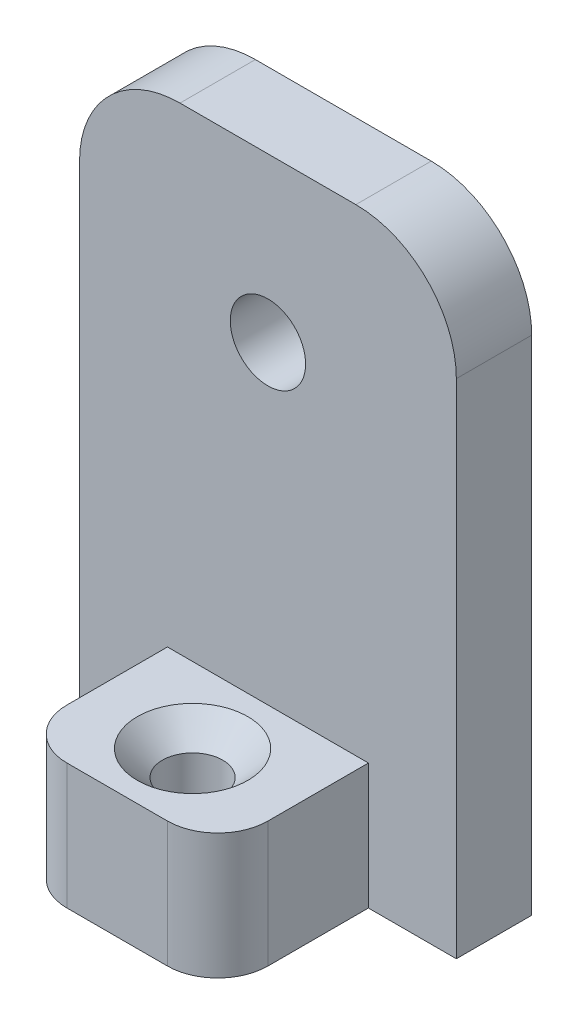
ISO-10303-21;
HEADER;
FILE_DESCRIPTION(('STEP AP214'),'2;1');
FILE_NAME('part.step','',(''),(''),'','','');
FILE_SCHEMA(('AUTOMOTIVE_DESIGN { 1 0 10303 214 1 1 1 1 }'));
ENDSEC;
DATA;
#1=APPLICATION_CONTEXT('core data for automotive mechanical design processes');
#2=APPLICATION_PROTOCOL_DEFINITION('international standard','automotive_design',2000,#1);
#3=PRODUCT_CONTEXT('',#1,'mechanical');
#4=PRODUCT('Part','Part','',(#3));
#5=PRODUCT_RELATED_PRODUCT_CATEGORY('part','',(#4));
#6=PRODUCT_DEFINITION_FORMATION('','',#4);
#7=PRODUCT_DEFINITION_CONTEXT('part definition',#1,'design');
#8=PRODUCT_DEFINITION('design','',#6,#7);
#9=PRODUCT_DEFINITION_SHAPE('','',#8);
#10=(LENGTH_UNIT() NAMED_UNIT(*) SI_UNIT(.MILLI.,.METRE.));
#11=(NAMED_UNIT(*) PLANE_ANGLE_UNIT() SI_UNIT($,.RADIAN.));
#12=(NAMED_UNIT(*) SI_UNIT($,.STERADIAN.) SOLID_ANGLE_UNIT());
#13=UNCERTAINTY_MEASURE_WITH_UNIT(LENGTH_MEASURE(1.E-05),#10,'distance_accuracy_value','');
#14=(GEOMETRIC_REPRESENTATION_CONTEXT(3) GLOBAL_UNCERTAINTY_ASSIGNED_CONTEXT((#13)) GLOBAL_UNIT_ASSIGNED_CONTEXT((#10,
#11,#12)) REPRESENTATION_CONTEXT('',''));
#15=CARTESIAN_POINT('',(0.,0.,0.));
#16=DIRECTION('',(0.,0.,1.));
#17=DIRECTION('',(1.,0.,0.));
#18=AXIS2_PLACEMENT_3D('',#15,#16,#17);
#19=CARTESIAN_POINT('',(0.,0.,3.));
#20=DIRECTION('',(0.,0.,-1.));
#21=DIRECTION('',(-1.,0.,0.));
#22=AXIS2_PLACEMENT_3D('',#19,#20,#21);
#23=PLANE('',#22);
#24=CARTESIAN_POINT('',(0.,5.49999999999999,3.));
#25=DIRECTION('',(0.,0.,-1.));
#26=DIRECTION('',(-1.,0.,0.));
#27=AXIS2_PLACEMENT_3D('',#24,#25,#26);
#28=CIRCLE('',#27,1.5);
#29=CARTESIAN_POINT('',(-1.5,5.49999999999999,3.));
#30=VERTEX_POINT('',#29);
#31=EDGE_CURVE('E259',#30,#30,#28,.F.);
#32=ORIENTED_EDGE('',*,*,#31,.F.);
#33=EDGE_LOOP('',(#32));
#34=FACE_BOUND('',#33,.T.);
#35=DIRECTION('',(-1.,0.,0.));
#36=VECTOR('',#35,1.);
#37=CARTESIAN_POINT('',(-7.5,12.,3.));
#38=LINE('',#37,#36);
#39=CARTESIAN_POINT('',(3.5,12.,3.));
#40=VERTEX_POINT('',#39);
#41=CARTESIAN_POINT('',(-3.5,12.,3.));
#42=VERTEX_POINT('',#41);
#43=EDGE_CURVE('E164',#40,#42,#38,.T.);
#44=ORIENTED_EDGE('',*,*,#43,.T.);
#45=CARTESIAN_POINT('',(-3.5,8.,3.));
#46=DIRECTION('',(0.,0.,-1.));
#47=DIRECTION('',(-1.,0.,0.));
#48=AXIS2_PLACEMENT_3D('',#45,#46,#47);
#49=CIRCLE('',#48,4.);
#50=CARTESIAN_POINT('',(-7.5,8.,3.));
#51=VERTEX_POINT('',#50);
#52=EDGE_CURVE('E43',#42,#51,#49,.F.);
#53=ORIENTED_EDGE('',*,*,#52,.T.);
#54=DIRECTION('',(0.,-1.,0.));
#55=VECTOR('',#54,1.);
#56=CARTESIAN_POINT('',(-7.5,-12.,3.));
#57=LINE('',#56,#55);
#58=CARTESIAN_POINT('',(-7.5,-12.,3.));
#59=VERTEX_POINT('',#58);
#60=EDGE_CURVE('E167',#51,#59,#57,.T.);
#61=ORIENTED_EDGE('',*,*,#60,.T.);
#62=DIRECTION('',(1.,0.,0.));
#63=VECTOR('',#62,1.);
#64=CARTESIAN_POINT('',(-7.5,-12.,3.));
#65=LINE('',#64,#63);
#66=CARTESIAN_POINT('',(-4.,-12.,3.));
#67=VERTEX_POINT('',#66);
#68=EDGE_CURVE('E170',#59,#67,#65,.T.);
#69=ORIENTED_EDGE('',*,*,#68,.T.);
#70=DIRECTION('',(0.,-1.,0.));
#71=VECTOR('',#70,1.);
#72=CARTESIAN_POINT('',(-4.,-12.,3.));
#73=LINE('',#72,#71);
#74=CARTESIAN_POINT('',(-4.,-7.,3.));
#75=VERTEX_POINT('',#74);
#76=EDGE_CURVE('E146',#75,#67,#73,.T.);
#77=ORIENTED_EDGE('',*,*,#76,.F.);
#78=DIRECTION('',(-1.,0.,0.));
#79=VECTOR('',#78,1.);
#80=CARTESIAN_POINT('',(-4.,-7.,3.));
#81=LINE('',#80,#79);
#82=CARTESIAN_POINT('',(4.,-7.,3.));
#83=VERTEX_POINT('',#82);
#84=EDGE_CURVE('E131',#83,#75,#81,.T.);
#85=ORIENTED_EDGE('',*,*,#84,.F.);
#86=DIRECTION('',(0.,1.,0.));
#87=VECTOR('',#86,1.);
#88=CARTESIAN_POINT('',(4.,-12.,3.));
#89=LINE('',#88,#87);
#90=CARTESIAN_POINT('',(4.,-12.,3.));
#91=VERTEX_POINT('',#90);
#92=EDGE_CURVE('E142',#91,#83,#89,.T.);
#93=ORIENTED_EDGE('',*,*,#92,.F.);
#94=CARTESIAN_POINT('',(7.5,-12.,3.));
#95=VERTEX_POINT('',#94);
#96=EDGE_CURVE('E169',#91,#95,#65,.T.);
#97=ORIENTED_EDGE('',*,*,#96,.T.);
#98=DIRECTION('',(0.,1.,0.));
#99=VECTOR('',#98,1.);
#100=CARTESIAN_POINT('',(7.5,-12.,3.));
#101=LINE('',#100,#99);
#102=CARTESIAN_POINT('',(7.5,8.,3.));
#103=VERTEX_POINT('',#102);
#104=EDGE_CURVE('E162',#95,#103,#101,.T.);
#105=ORIENTED_EDGE('',*,*,#104,.T.);
#106=CARTESIAN_POINT('',(3.5,8.,3.));
#107=DIRECTION('',(0.,0.,-1.));
#108=DIRECTION('',(-1.,0.,0.));
#109=AXIS2_PLACEMENT_3D('',#106,#107,#108);
#110=CIRCLE('',#109,4.);
#111=EDGE_CURVE('E212',#103,#40,#110,.F.);
#112=ORIENTED_EDGE('',*,*,#111,.T.);
#113=EDGE_LOOP('',(#44,#53,#61,#69,#77,#85,#93,#97,#105,#112));
#114=FACE_BOUND('',#113,.T.);
#115=ADVANCED_FACE('F35',(#34,#114),#23,.F.);
#116=CARTESIAN_POINT('',(7.5,-12.,3.));
#117=DIRECTION('',(-1.,0.,0.));
#118=DIRECTION('',(0.,0.,1.));
#119=AXIS2_PLACEMENT_3D('',#116,#117,#118);
#120=PLANE('',#119);
#121=DIRECTION('',(0.,1.,0.));
#122=VECTOR('',#121,1.);
#123=CARTESIAN_POINT('',(7.5,-12.,0.));
#124=LINE('',#123,#122);
#125=CARTESIAN_POINT('',(7.5,-12.,0.));
#126=VERTEX_POINT('',#125);
#127=CARTESIAN_POINT('',(7.5,8.,0.));
#128=VERTEX_POINT('',#127);
#129=EDGE_CURVE('E161',#126,#128,#124,.T.);
#130=ORIENTED_EDGE('',*,*,#129,.T.);
#131=DIRECTION('',(0.,0.,-1.));
#132=VECTOR('',#131,1.);
#133=CARTESIAN_POINT('',(7.5,8.,3.));
#134=LINE('',#133,#132);
#135=EDGE_CURVE('E11',#128,#103,#134,.F.);
#136=ORIENTED_EDGE('',*,*,#135,.T.);
#137=ORIENTED_EDGE('',*,*,#104,.F.);
#138=DIRECTION('',(0.,0.,-1.));
#139=VECTOR('',#138,1.);
#140=CARTESIAN_POINT('',(7.5,-12.,3.));
#141=LINE('',#140,#139);
#142=EDGE_CURVE('E172',#95,#126,#141,.T.);
#143=ORIENTED_EDGE('',*,*,#142,.T.);
#144=EDGE_LOOP('',(#130,#136,#137,#143));
#145=FACE_BOUND('',#144,.T.);
#146=ADVANCED_FACE('F232',(#145),#120,.F.);
#147=CARTESIAN_POINT('',(-7.5,12.,3.));
#148=DIRECTION('',(0.,-1.,0.));
#149=DIRECTION('',(0.,0.,-1.));
#150=AXIS2_PLACEMENT_3D('',#147,#148,#149);
#151=PLANE('',#150);
#152=DIRECTION('',(-1.,0.,0.));
#153=VECTOR('',#152,1.);
#154=CARTESIAN_POINT('',(-7.5,12.,0.));
#155=LINE('',#154,#153);
#156=CARTESIAN_POINT('',(3.5,12.,0.));
#157=VERTEX_POINT('',#156);
#158=CARTESIAN_POINT('',(-3.5,12.,0.));
#159=VERTEX_POINT('',#158);
#160=EDGE_CURVE('E174',#157,#159,#155,.T.);
#161=ORIENTED_EDGE('',*,*,#160,.T.);
#162=DIRECTION('',(0.,0.,-1.));
#163=VECTOR('',#162,1.);
#164=CARTESIAN_POINT('',(-3.5,12.,3.));
#165=LINE('',#164,#163);
#166=EDGE_CURVE('E56',#159,#42,#165,.F.);
#167=ORIENTED_EDGE('',*,*,#166,.T.);
#168=ORIENTED_EDGE('',*,*,#43,.F.);
#169=DIRECTION('',(0.,0.,-1.));
#170=VECTOR('',#169,1.);
#171=CARTESIAN_POINT('',(3.5,12.,3.));
#172=LINE('',#171,#170);
#173=EDGE_CURVE('E208',#40,#157,#172,.T.);
#174=ORIENTED_EDGE('',*,*,#173,.T.);
#175=EDGE_LOOP('',(#161,#167,#168,#174));
#176=FACE_BOUND('',#175,.T.);
#177=ADVANCED_FACE('F227',(#176),#151,.F.);
#178=CARTESIAN_POINT('',(-7.5,-12.,3.));
#179=DIRECTION('',(1.,0.,0.));
#180=DIRECTION('',(0.,0.,-1.));
#181=AXIS2_PLACEMENT_3D('',#178,#179,#180);
#182=PLANE('',#181);
#183=ORIENTED_EDGE('',*,*,#60,.F.);
#184=DIRECTION('',(0.,0.,-1.));
#185=VECTOR('',#184,1.);
#186=CARTESIAN_POINT('',(-7.5,8.,3.));
#187=LINE('',#186,#185);
#188=CARTESIAN_POINT('',(-7.5,8.,0.));
#189=VERTEX_POINT('',#188);
#190=EDGE_CURVE('E201',#51,#189,#187,.T.);
#191=ORIENTED_EDGE('',*,*,#190,.T.);
#192=DIRECTION('',(0.,-1.,0.));
#193=VECTOR('',#192,1.);
#194=CARTESIAN_POINT('',(-7.5,-12.,0.));
#195=LINE('',#194,#193);
#196=CARTESIAN_POINT('',(-7.5,-12.,0.));
#197=VERTEX_POINT('',#196);
#198=EDGE_CURVE('E176',#189,#197,#195,.T.);
#199=ORIENTED_EDGE('',*,*,#198,.T.);
#200=DIRECTION('',(0.,0.,-1.));
#201=VECTOR('',#200,1.);
#202=CARTESIAN_POINT('',(-7.5,-12.,3.));
#203=LINE('',#202,#201);
#204=EDGE_CURVE('E181',#59,#197,#203,.T.);
#205=ORIENTED_EDGE('',*,*,#204,.F.);
#206=EDGE_LOOP('',(#183,#191,#199,#205));
#207=FACE_BOUND('',#206,.T.);
#208=ADVANCED_FACE('F219',(#207),#182,.F.);
#209=CARTESIAN_POINT('',(-7.5,-12.,3.));
#210=DIRECTION('',(0.,1.,0.));
#211=DIRECTION('',(0.,0.,1.));
#212=AXIS2_PLACEMENT_3D('',#209,#210,#211);
#213=PLANE('',#212);
#214=CARTESIAN_POINT('',(0.,-12.,6.));
#215=DIRECTION('',(0.,1.,0.));
#216=DIRECTION('',(0.,0.,1.));
#217=AXIS2_PLACEMENT_3D('',#214,#215,#216);
#218=CIRCLE('',#217,1.2);
#219=CARTESIAN_POINT('',(0.,-12.,7.2));
#220=VERTEX_POINT('',#219);
#221=EDGE_CURVE('E152',#220,#220,#218,.F.);
#222=ORIENTED_EDGE('',*,*,#221,.F.);
#223=EDGE_LOOP('',(#222));
#224=FACE_BOUND('',#223,.T.);
#225=DIRECTION('',(0.,0.,-1.));
#226=VECTOR('',#225,1.);
#227=CARTESIAN_POINT('',(4.,-12.,9.));
#228=LINE('',#227,#226);
#229=CARTESIAN_POINT('',(4.,-12.,7.));
#230=VERTEX_POINT('',#229);
#231=EDGE_CURVE('E136',#230,#91,#228,.T.);
#232=ORIENTED_EDGE('',*,*,#231,.F.);
#233=CARTESIAN_POINT('',(2.,-12.,7.));
#234=DIRECTION('',(0.,1.,0.));
#235=DIRECTION('',(0.,0.,1.));
#236=AXIS2_PLACEMENT_3D('',#233,#234,#235);
#237=CIRCLE('',#236,2.);
#238=CARTESIAN_POINT('',(2.,-12.,9.));
#239=VERTEX_POINT('',#238);
#240=EDGE_CURVE('E197',#230,#239,#237,.F.);
#241=ORIENTED_EDGE('',*,*,#240,.T.);
#242=DIRECTION('',(1.,0.,0.));
#243=VECTOR('',#242,1.);
#244=CARTESIAN_POINT('',(-4.,-12.,9.));
#245=LINE('',#244,#243);
#246=CARTESIAN_POINT('',(-2.,-12.,9.));
#247=VERTEX_POINT('',#246);
#248=EDGE_CURVE('E147',#247,#239,#245,.T.);
#249=ORIENTED_EDGE('',*,*,#248,.F.);
#250=CARTESIAN_POINT('',(-2.,-12.,7.));
#251=DIRECTION('',(0.,1.,0.));
#252=DIRECTION('',(0.,0.,1.));
#253=AXIS2_PLACEMENT_3D('',#250,#251,#252);
#254=CIRCLE('',#253,2.);
#255=CARTESIAN_POINT('',(-4.,-12.,7.));
#256=VERTEX_POINT('',#255);
#257=EDGE_CURVE('E195',#247,#256,#254,.F.);
#258=ORIENTED_EDGE('',*,*,#257,.T.);
#259=DIRECTION('',(0.,0.,-1.));
#260=VECTOR('',#259,1.);
#261=CARTESIAN_POINT('',(-4.,-12.,9.));
#262=LINE('',#261,#260);
#263=EDGE_CURVE('E159',#256,#67,#262,.T.);
#264=ORIENTED_EDGE('',*,*,#263,.T.);
#265=ORIENTED_EDGE('',*,*,#68,.F.);
#266=ORIENTED_EDGE('',*,*,#204,.T.);
#267=DIRECTION('',(1.,0.,0.));
#268=VECTOR('',#267,1.);
#269=CARTESIAN_POINT('',(-7.5,-12.,0.));
#270=LINE('',#269,#268);
#271=EDGE_CURVE('E165',#197,#126,#270,.T.);
#272=ORIENTED_EDGE('',*,*,#271,.T.);
#273=ORIENTED_EDGE('',*,*,#142,.F.);
#274=ORIENTED_EDGE('',*,*,#96,.F.);
#275=EDGE_LOOP('',(#232,#241,#249,#258,#264,#265,#266,#272,#273,#274));
#276=FACE_BOUND('',#275,.T.);
#277=ADVANCED_FACE('F235',(#224,#276),#213,.F.);
#278=CARTESIAN_POINT('',(0.,0.,0.));
#279=DIRECTION('',(0.,0.,-1.));
#280=DIRECTION('',(-1.,0.,0.));
#281=AXIS2_PLACEMENT_3D('',#278,#279,#280);
#282=PLANE('',#281);
#283=CARTESIAN_POINT('',(0.,5.49999999999999,0.));
#284=DIRECTION('',(0.,0.,-1.));
#285=DIRECTION('',(-1.,0.,0.));
#286=AXIS2_PLACEMENT_3D('',#283,#284,#285);
#287=CIRCLE('',#286,1.5);
#288=CARTESIAN_POINT('',(-1.5,5.49999999999999,0.));
#289=VERTEX_POINT('',#288);
#290=EDGE_CURVE('E264',#289,#289,#287,.T.);
#291=ORIENTED_EDGE('',*,*,#290,.F.);
#292=EDGE_LOOP('',(#291));
#293=FACE_BOUND('',#292,.T.);
#294=ORIENTED_EDGE('',*,*,#198,.F.);
#295=CARTESIAN_POINT('',(-3.5,8.,0.));
#296=DIRECTION('',(0.,0.,-1.));
#297=DIRECTION('',(-1.,0.,0.));
#298=AXIS2_PLACEMENT_3D('',#295,#296,#297);
#299=CIRCLE('',#298,4.);
#300=EDGE_CURVE('E206',#189,#159,#299,.T.);
#301=ORIENTED_EDGE('',*,*,#300,.T.);
#302=ORIENTED_EDGE('',*,*,#160,.F.);
#303=CARTESIAN_POINT('',(3.5,8.,0.));
#304=DIRECTION('',(0.,0.,-1.));
#305=DIRECTION('',(-1.,0.,0.));
#306=AXIS2_PLACEMENT_3D('',#303,#304,#305);
#307=CIRCLE('',#306,4.);
#308=EDGE_CURVE('E204',#157,#128,#307,.T.);
#309=ORIENTED_EDGE('',*,*,#308,.T.);
#310=ORIENTED_EDGE('',*,*,#129,.F.);
#311=ORIENTED_EDGE('',*,*,#271,.F.);
#312=EDGE_LOOP('',(#294,#301,#302,#309,#310,#311));
#313=FACE_BOUND('',#312,.T.);
#314=ADVANCED_FACE('F225',(#293,#313),#282,.T.);
#315=CARTESIAN_POINT('',(-4.,-12.,9.));
#316=DIRECTION('',(1.,0.,0.));
#317=DIRECTION('',(0.,0.,-1.));
#318=AXIS2_PLACEMENT_3D('',#315,#316,#317);
#319=PLANE('',#318);
#320=ORIENTED_EDGE('',*,*,#263,.F.);
#321=DIRECTION('',(0.,-1.,0.));
#322=VECTOR('',#321,1.);
#323=CARTESIAN_POINT('',(-4.,-12.,7.));
#324=LINE('',#323,#322);
#325=CARTESIAN_POINT('',(-4.,-7.,7.));
#326=VERTEX_POINT('',#325);
#327=EDGE_CURVE('E199',#256,#326,#324,.F.);
#328=ORIENTED_EDGE('',*,*,#327,.T.);
#329=DIRECTION('',(0.,0.,-1.));
#330=VECTOR('',#329,1.);
#331=CARTESIAN_POINT('',(-4.,-7.,9.));
#332=LINE('',#331,#330);
#333=EDGE_CURVE('E137',#326,#75,#332,.T.);
#334=ORIENTED_EDGE('',*,*,#333,.T.);
#335=ORIENTED_EDGE('',*,*,#76,.T.);
#336=EDGE_LOOP('',(#320,#328,#334,#335));
#337=FACE_BOUND('',#336,.T.);
#338=ADVANCED_FACE('F238',(#337),#319,.F.);
#339=CARTESIAN_POINT('',(4.,-12.,9.));
#340=DIRECTION('',(-1.,0.,0.));
#341=DIRECTION('',(0.,0.,1.));
#342=AXIS2_PLACEMENT_3D('',#339,#340,#341);
#343=PLANE('',#342);
#344=DIRECTION('',(0.,0.,-1.));
#345=VECTOR('',#344,1.);
#346=CARTESIAN_POINT('',(4.,-7.,9.));
#347=LINE('',#346,#345);
#348=CARTESIAN_POINT('',(4.,-7.,7.));
#349=VERTEX_POINT('',#348);
#350=EDGE_CURVE('E126',#349,#83,#347,.T.);
#351=ORIENTED_EDGE('',*,*,#350,.F.);
#352=DIRECTION('',(0.,1.,0.));
#353=VECTOR('',#352,1.);
#354=CARTESIAN_POINT('',(4.,-12.,7.));
#355=LINE('',#354,#353);
#356=EDGE_CURVE('E193',#349,#230,#355,.F.);
#357=ORIENTED_EDGE('',*,*,#356,.T.);
#358=ORIENTED_EDGE('',*,*,#231,.T.);
#359=ORIENTED_EDGE('',*,*,#92,.T.);
#360=EDGE_LOOP('',(#351,#357,#358,#359));
#361=FACE_BOUND('',#360,.T.);
#362=ADVANCED_FACE('F149',(#361),#343,.F.);
#363=CARTESIAN_POINT('',(-4.,-7.,9.));
#364=DIRECTION('',(0.,-1.,0.));
#365=DIRECTION('',(0.,0.,-1.));
#366=AXIS2_PLACEMENT_3D('',#363,#364,#365);
#367=PLANE('',#366);
#368=CARTESIAN_POINT('',(0.,-7.,6.));
#369=DIRECTION('',(0.,1.,0.));
#370=DIRECTION('',(0.,0.,1.));
#371=AXIS2_PLACEMENT_3D('',#368,#369,#370);
#372=CIRCLE('',#371,2.2);
#373=CARTESIAN_POINT('',(0.,-7.,8.2));
#374=VERTEX_POINT('',#373);
#375=EDGE_CURVE('E256',#374,#374,#372,.T.);
#376=ORIENTED_EDGE('',*,*,#375,.F.);
#377=EDGE_LOOP('',(#376));
#378=FACE_BOUND('',#377,.T.);
#379=DIRECTION('',(-1.,0.,0.));
#380=VECTOR('',#379,1.);
#381=CARTESIAN_POINT('',(-4.,-7.,9.));
#382=LINE('',#381,#380);
#383=CARTESIAN_POINT('',(2.,-7.,9.));
#384=VERTEX_POINT('',#383);
#385=CARTESIAN_POINT('',(-2.,-7.,9.));
#386=VERTEX_POINT('',#385);
#387=EDGE_CURVE('E156',#384,#386,#382,.T.);
#388=ORIENTED_EDGE('',*,*,#387,.F.);
#389=CARTESIAN_POINT('',(2.,-7.,7.));
#390=DIRECTION('',(0.,-1.,0.));
#391=DIRECTION('',(0.,0.,-1.));
#392=AXIS2_PLACEMENT_3D('',#389,#390,#391);
#393=CIRCLE('',#392,2.);
#394=EDGE_CURVE('E132',#384,#349,#393,.F.);
#395=ORIENTED_EDGE('',*,*,#394,.T.);
#396=ORIENTED_EDGE('',*,*,#350,.T.);
#397=ORIENTED_EDGE('',*,*,#84,.T.);
#398=ORIENTED_EDGE('',*,*,#333,.F.);
#399=CARTESIAN_POINT('',(-2.,-7.,7.));
#400=DIRECTION('',(0.,-1.,0.));
#401=DIRECTION('',(0.,0.,-1.));
#402=AXIS2_PLACEMENT_3D('',#399,#400,#401);
#403=CIRCLE('',#402,2.);
#404=EDGE_CURVE('E190',#326,#386,#403,.F.);
#405=ORIENTED_EDGE('',*,*,#404,.T.);
#406=EDGE_LOOP('',(#388,#395,#396,#397,#398,#405));
#407=FACE_BOUND('',#406,.T.);
#408=ADVANCED_FACE('F129',(#378,#407),#367,.F.);
#409=CARTESIAN_POINT('',(0.,0.,9.));
#410=DIRECTION('',(0.,0.,-1.));
#411=DIRECTION('',(-1.,0.,0.));
#412=AXIS2_PLACEMENT_3D('',#409,#410,#411);
#413=PLANE('',#412);
#414=ORIENTED_EDGE('',*,*,#248,.T.);
#415=DIRECTION('',(0.,1.,0.));
#416=VECTOR('',#415,1.);
#417=CARTESIAN_POINT('',(2.,0.,9.));
#418=LINE('',#417,#416);
#419=EDGE_CURVE('E187',#239,#384,#418,.T.);
#420=ORIENTED_EDGE('',*,*,#419,.T.);
#421=ORIENTED_EDGE('',*,*,#387,.T.);
#422=DIRECTION('',(0.,-1.,0.));
#423=VECTOR('',#422,1.);
#424=CARTESIAN_POINT('',(-2.,0.,9.));
#425=LINE('',#424,#423);
#426=EDGE_CURVE('E184',#386,#247,#425,.T.);
#427=ORIENTED_EDGE('',*,*,#426,.T.);
#428=EDGE_LOOP('',(#414,#420,#421,#427));
#429=FACE_BOUND('',#428,.T.);
#430=ADVANCED_FACE('F248',(#429),#413,.F.);
#431=CARTESIAN_POINT('',(0.,-7.,6.));
#432=DIRECTION('',(0.,1.,0.));
#433=DIRECTION('',(0.,0.,1.));
#434=AXIS2_PLACEMENT_3D('',#431,#432,#433);
#435=CYLINDRICAL_SURFACE('',#434,1.2);
#436=ORIENTED_EDGE('',*,*,#221,.T.);
#437=EDGE_LOOP('',(#436));
#438=FACE_BOUND('',#437,.T.);
#439=CARTESIAN_POINT('',(0.,-8.,6.));
#440=DIRECTION('',(0.,1.,0.));
#441=DIRECTION('',(0.,0.,1.));
#442=AXIS2_PLACEMENT_3D('',#439,#440,#441);
#443=CIRCLE('',#442,1.2);
#444=CARTESIAN_POINT('',(0.,-8.,7.2));
#445=VERTEX_POINT('',#444);
#446=EDGE_CURVE('E253',#445,#445,#443,.T.);
#447=ORIENTED_EDGE('',*,*,#446,.T.);
#448=EDGE_LOOP('',(#447));
#449=FACE_BOUND('',#448,.T.);
#450=ADVANCED_FACE('F295',(#438,#449),#435,.F.);
#451=CARTESIAN_POINT('',(0.,-7.,6.));
#452=DIRECTION('',(0.,1.,0.));
#453=DIRECTION('',(0.,0.,1.));
#454=AXIS2_PLACEMENT_3D('',#451,#452,#453);
#455=CONICAL_SURFACE('',#454,2.2,0.785398163397449);
#456=ORIENTED_EDGE('',*,*,#446,.F.);
#457=EDGE_LOOP('',(#456));
#458=FACE_BOUND('',#457,.T.);
#459=ORIENTED_EDGE('',*,*,#375,.T.);
#460=EDGE_LOOP('',(#459));
#461=FACE_BOUND('',#460,.T.);
#462=ADVANCED_FACE('F298',(#458,#461),#455,.F.);
#463=CARTESIAN_POINT('',(2.,0.,7.));
#464=DIRECTION('',(0.,1.,0.));
#465=DIRECTION('',(0.,0.,1.));
#466=AXIS2_PLACEMENT_3D('',#463,#464,#465);
#467=CYLINDRICAL_SURFACE('',#466,2.);
#468=ORIENTED_EDGE('',*,*,#240,.F.);
#469=ORIENTED_EDGE('',*,*,#356,.F.);
#470=ORIENTED_EDGE('',*,*,#394,.F.);
#471=ORIENTED_EDGE('',*,*,#419,.F.);
#472=EDGE_LOOP('',(#468,#469,#470,#471));
#473=FACE_BOUND('',#472,.T.);
#474=ADVANCED_FACE('F302',(#473),#467,.T.);
#475=CARTESIAN_POINT('',(-2.,0.,7.));
#476=DIRECTION('',(0.,-1.,0.));
#477=DIRECTION('',(0.,0.,-1.));
#478=AXIS2_PLACEMENT_3D('',#475,#476,#477);
#479=CYLINDRICAL_SURFACE('',#478,2.);
#480=ORIENTED_EDGE('',*,*,#404,.F.);
#481=ORIENTED_EDGE('',*,*,#327,.F.);
#482=ORIENTED_EDGE('',*,*,#257,.F.);
#483=ORIENTED_EDGE('',*,*,#426,.F.);
#484=EDGE_LOOP('',(#480,#481,#482,#483));
#485=FACE_BOUND('',#484,.T.);
#486=ADVANCED_FACE('F244',(#485),#479,.T.);
#487=CARTESIAN_POINT('',(0.,5.49999999999999,7.24264068711929));
#488=DIRECTION('',(0.,0.,-1.));
#489=DIRECTION('',(-1.,0.,0.));
#490=AXIS2_PLACEMENT_3D('',#487,#488,#489);
#491=CYLINDRICAL_SURFACE('',#490,1.5);
#492=ORIENTED_EDGE('',*,*,#31,.T.);
#493=EDGE_LOOP('',(#492));
#494=FACE_BOUND('',#493,.T.);
#495=ORIENTED_EDGE('',*,*,#290,.T.);
#496=EDGE_LOOP('',(#495));
#497=FACE_BOUND('',#496,.T.);
#498=ADVANCED_FACE('F268',(#494,#497),#491,.F.);
#499=CARTESIAN_POINT('',(-3.5,8.,3.));
#500=DIRECTION('',(0.,0.,-1.));
#501=DIRECTION('',(-1.,0.,0.));
#502=AXIS2_PLACEMENT_3D('',#499,#500,#501);
#503=CYLINDRICAL_SURFACE('',#502,4.);
#504=ORIENTED_EDGE('',*,*,#52,.F.);
#505=ORIENTED_EDGE('',*,*,#166,.F.);
#506=ORIENTED_EDGE('',*,*,#300,.F.);
#507=ORIENTED_EDGE('',*,*,#190,.F.);
#508=EDGE_LOOP('',(#504,#505,#506,#507));
#509=FACE_BOUND('',#508,.T.);
#510=ADVANCED_FACE('F222',(#509),#503,.T.);
#511=CARTESIAN_POINT('',(3.5,8.,3.));
#512=DIRECTION('',(0.,0.,-1.));
#513=DIRECTION('',(-1.,0.,0.));
#514=AXIS2_PLACEMENT_3D('',#511,#512,#513);
#515=CYLINDRICAL_SURFACE('',#514,4.);
#516=ORIENTED_EDGE('',*,*,#111,.F.);
#517=ORIENTED_EDGE('',*,*,#135,.F.);
#518=ORIENTED_EDGE('',*,*,#308,.F.);
#519=ORIENTED_EDGE('',*,*,#173,.F.);
#520=EDGE_LOOP('',(#516,#517,#518,#519));
#521=FACE_BOUND('',#520,.T.);
#522=ADVANCED_FACE('F37',(#521),#515,.T.);
#523=CLOSED_SHELL('',(#115,#146,#177,#208,#277,#314,#338,#362,#408,#430,#450,#462,#474,#486,
#498,#510,#522));
#524=MANIFOLD_SOLID_BREP('B2',#523);
#525=ADVANCED_BREP_SHAPE_REPRESENTATION('',(#18,#524),#14);
#526=SHAPE_DEFINITION_REPRESENTATION(#9,#525);
ENDSEC;
END-ISO-10303-21;
